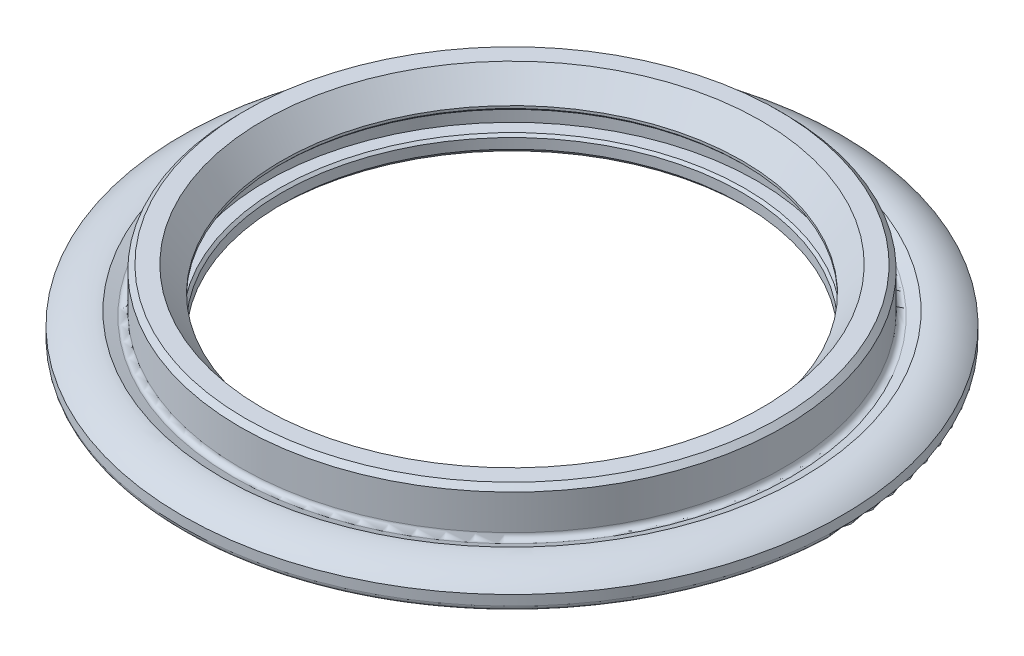
ISO-10303-21;
HEADER;
FILE_DESCRIPTION(('STEP AP214'),'2;1');
FILE_NAME('part.step','',(''),(''),'','','');
FILE_SCHEMA(('AUTOMOTIVE_DESIGN { 1 0 10303 214 1 1 1 1 }'));
ENDSEC;
DATA;
#1=APPLICATION_CONTEXT('core data for automotive mechanical design processes');
#2=APPLICATION_PROTOCOL_DEFINITION('international standard','automotive_design',2000,#1);
#3=PRODUCT_CONTEXT('',#1,'mechanical');
#4=PRODUCT('Part','Part','',(#3));
#5=PRODUCT_RELATED_PRODUCT_CATEGORY('part','',(#4));
#6=PRODUCT_DEFINITION_FORMATION('','',#4);
#7=PRODUCT_DEFINITION_CONTEXT('part definition',#1,'design');
#8=PRODUCT_DEFINITION('design','',#6,#7);
#9=PRODUCT_DEFINITION_SHAPE('','',#8);
#10=(LENGTH_UNIT() NAMED_UNIT(*) SI_UNIT(.MILLI.,.METRE.));
#11=(NAMED_UNIT(*) PLANE_ANGLE_UNIT() SI_UNIT($,.RADIAN.));
#12=(NAMED_UNIT(*) SI_UNIT($,.STERADIAN.) SOLID_ANGLE_UNIT());
#13=UNCERTAINTY_MEASURE_WITH_UNIT(LENGTH_MEASURE(1.E-05),#10,'distance_accuracy_value','');
#14=(GEOMETRIC_REPRESENTATION_CONTEXT(3) GLOBAL_UNCERTAINTY_ASSIGNED_CONTEXT((#13)) GLOBAL_UNIT_ASSIGNED_CONTEXT((#10,
#11,#12)) REPRESENTATION_CONTEXT('',''));
#15=CARTESIAN_POINT('',(0.,0.,0.));
#16=DIRECTION('',(0.,0.,1.));
#17=DIRECTION('',(1.,0.,0.));
#18=AXIS2_PLACEMENT_3D('',#15,#16,#17);
#19=CARTESIAN_POINT('',(63.6666666666667,0.,0.));
#20=DIRECTION('',(0.,-1.,0.));
#21=DIRECTION('',(0.,0.,-1.));
#22=AXIS2_PLACEMENT_3D('',#19,#20,#21);
#23=PLANE('',#22);
#24=CARTESIAN_POINT('',(0.,0.,0.));
#25=DIRECTION('',(0.,-1.,0.));
#26=DIRECTION('',(0.,0.,-1.));
#27=AXIS2_PLACEMENT_3D('',#24,#25,#26);
#28=CIRCLE('',#27,64.5);
#29=CARTESIAN_POINT('',(0.,0.,-64.5));
#30=VERTEX_POINT('',#29);
#31=EDGE_CURVE('E72',#30,#30,#28,.T.);
#32=ORIENTED_EDGE('',*,*,#31,.T.);
#33=EDGE_LOOP('',(#32));
#34=FACE_BOUND('',#33,.T.);
#35=CARTESIAN_POINT('',(0.,0.,0.));
#36=DIRECTION('',(0.,-1.,0.));
#37=DIRECTION('',(0.,0.,-1.));
#38=AXIS2_PLACEMENT_3D('',#35,#36,#37);
#39=CIRCLE('',#38,64.);
#40=CARTESIAN_POINT('',(0.,0.,-64.));
#41=VERTEX_POINT('',#40);
#42=EDGE_CURVE('E75',#41,#41,#39,.F.);
#43=ORIENTED_EDGE('',*,*,#42,.T.);
#44=EDGE_LOOP('',(#43));
#45=FACE_BOUND('',#44,.T.);
#46=ADVANCED_FACE('F31',(#34,#45),#23,.T.);
#47=CARTESIAN_POINT('',(0.,2.,0.));
#48=DIRECTION('',(0.,-1.,0.));
#49=DIRECTION('',(0.,0.,-1.));
#50=AXIS2_PLACEMENT_3D('',#47,#48,#49);
#51=CONICAL_SURFACE('',#50,61.,0.927295218001611);
#52=CARTESIAN_POINT('',(0.,0.200000000000006,0.));
#53=DIRECTION('',(0.,1.,0.));
#54=DIRECTION('',(0.,0.,1.));
#55=AXIS2_PLACEMENT_3D('',#52,#53,#54);
#56=CIRCLE('',#55,63.4);
#57=CARTESIAN_POINT('',(0.,0.200000000000006,63.4));
#58=VERTEX_POINT('',#57);
#59=EDGE_CURVE('E78',#58,#58,#56,.F.);
#60=ORIENTED_EDGE('',*,*,#59,.T.);
#61=EDGE_LOOP('',(#60));
#62=FACE_BOUND('',#61,.T.);
#63=CARTESIAN_POINT('',(0.,1.1509819027774,0.));
#64=DIRECTION('',(0.,-1.,0.));
#65=DIRECTION('',(0.,0.,-1.));
#66=AXIS2_PLACEMENT_3D('',#63,#64,#65);
#67=CIRCLE('',#66,62.1320241296301);
#68=CARTESIAN_POINT('',(0.,1.1509819027774,-62.1320241296301));
#69=VERTEX_POINT('',#68);
#70=EDGE_CURVE('E81',#69,#69,#67,.F.);
#71=ORIENTED_EDGE('',*,*,#70,.T.);
#72=EDGE_LOOP('',(#71));
#73=FACE_BOUND('',#72,.T.);
#74=ADVANCED_FACE('F126',(#62,#73),#51,.F.);
#75=CARTESIAN_POINT('',(0.,0.,0.));
#76=DIRECTION('',(0.,1.,0.));
#77=DIRECTION('',(0.,0.,1.));
#78=AXIS2_PLACEMENT_3D('',#75,#76,#77);
#79=CONICAL_SURFACE('',#78,58.,0.982793723247328);
#80=CARTESIAN_POINT('',(0.,1.21508249145309,0.));
#81=DIRECTION('',(0.,1.,0.));
#82=DIRECTION('',(0.,0.,1.));
#83=AXIS2_PLACEMENT_3D('',#80,#81,#82);
#84=CIRCLE('',#83,59.8226237371796);
#85=CARTESIAN_POINT('',(0.,1.21508249145309,59.8226237371796));
#86=VERTEX_POINT('',#85);
#87=EDGE_CURVE('E84',#86,#86,#84,.F.);
#88=ORIENTED_EDGE('',*,*,#87,.T.);
#89=EDGE_LOOP('',(#88));
#90=FACE_BOUND('',#89,.T.);
#91=CARTESIAN_POINT('',(0.,0.,0.));
#92=DIRECTION('',(0.,-1.,0.));
#93=DIRECTION('',(0.,0.,-1.));
#94=AXIS2_PLACEMENT_3D('',#91,#92,#93);
#95=CIRCLE('',#94,58.);
#96=CARTESIAN_POINT('',(0.,0.,-58.));
#97=VERTEX_POINT('',#96);
#98=EDGE_CURVE('E87',#97,#97,#95,.T.);
#99=ORIENTED_EDGE('',*,*,#98,.F.);
#100=EDGE_LOOP('',(#99));
#101=FACE_BOUND('',#100,.T.);
#102=ADVANCED_FACE('F132',(#90,#101),#79,.T.);
#103=CARTESIAN_POINT('',(45.75,0.,0.));
#104=DIRECTION('',(0.,-1.,0.));
#105=DIRECTION('',(0.,0.,-1.));
#106=AXIS2_PLACEMENT_3D('',#103,#104,#105);
#107=PLANE('',#106);
#108=CARTESIAN_POINT('',(0.,0.,0.));
#109=DIRECTION('',(0.,-1.,0.));
#110=DIRECTION('',(0.,0.,-1.));
#111=AXIS2_PLACEMENT_3D('',#108,#109,#110);
#112=CIRCLE('',#111,46.75);
#113=CARTESIAN_POINT('',(0.,0.,-46.75));
#114=VERTEX_POINT('',#113);
#115=EDGE_CURVE('E63',#114,#114,#112,.F.);
#116=ORIENTED_EDGE('',*,*,#115,.T.);
#117=EDGE_LOOP('',(#116));
#118=FACE_BOUND('',#117,.T.);
#119=ORIENTED_EDGE('',*,*,#98,.T.);
#120=EDGE_LOOP('',(#119));
#121=FACE_BOUND('',#120,.T.);
#122=ADVANCED_FACE('F203',(#118,#121),#107,.T.);
#123=CARTESIAN_POINT('',(0.,-63.3291029718349,0.));
#124=DIRECTION('',(0.,-1.,0.));
#125=DIRECTION('',(0.,0.,-1.));
#126=AXIS2_PLACEMENT_3D('',#123,#124,#125);
#127=CYLINDRICAL_SURFACE('',#126,45.75);
#128=CARTESIAN_POINT('',(0.,2.99999999999998,0.));
#129=DIRECTION('',(0.,1.,0.));
#130=DIRECTION('',(0.,0.,1.));
#131=AXIS2_PLACEMENT_3D('',#128,#129,#130);
#132=CIRCLE('',#131,45.75);
#133=CARTESIAN_POINT('',(0.,2.99999999999998,45.75));
#134=VERTEX_POINT('',#133);
#135=EDGE_CURVE('E57',#134,#134,#132,.T.);
#136=ORIENTED_EDGE('',*,*,#135,.T.);
#137=EDGE_LOOP('',(#136));
#138=FACE_BOUND('',#137,.T.);
#139=CARTESIAN_POINT('',(0.,1.,0.));
#140=DIRECTION('',(0.,-1.,0.));
#141=DIRECTION('',(0.,0.,-1.));
#142=AXIS2_PLACEMENT_3D('',#139,#140,#141);
#143=CIRCLE('',#142,45.75);
#144=CARTESIAN_POINT('',(0.,1.,-45.75));
#145=VERTEX_POINT('',#144);
#146=EDGE_CURVE('E66',#145,#145,#143,.T.);
#147=ORIENTED_EDGE('',*,*,#146,.T.);
#148=EDGE_LOOP('',(#147));
#149=FACE_BOUND('',#148,.T.);
#150=ADVANCED_FACE('F199',(#138,#149),#127,.F.);
#151=CARTESIAN_POINT('',(48.75,3.5,0.));
#152=DIRECTION('',(0.,1.,0.));
#153=DIRECTION('',(0.,0.,1.));
#154=AXIS2_PLACEMENT_3D('',#151,#152,#153);
#155=PLANE('',#154);
#156=CARTESIAN_POINT('',(0.,3.5,0.));
#157=DIRECTION('',(0.,1.,0.));
#158=DIRECTION('',(0.,0.,1.));
#159=AXIS2_PLACEMENT_3D('',#156,#157,#158);
#160=CIRCLE('',#159,46.25);
#161=CARTESIAN_POINT('',(0.,3.5,46.25));
#162=VERTEX_POINT('',#161);
#163=EDGE_CURVE('E60',#162,#162,#160,.F.);
#164=ORIENTED_EDGE('',*,*,#163,.T.);
#165=EDGE_LOOP('',(#164));
#166=FACE_BOUND('',#165,.T.);
#167=CARTESIAN_POINT('',(0.,3.5,0.));
#168=DIRECTION('',(0.,-1.,0.));
#169=DIRECTION('',(0.,0.,-1.));
#170=AXIS2_PLACEMENT_3D('',#167,#168,#169);
#171=CIRCLE('',#170,48.75);
#172=CARTESIAN_POINT('',(0.,3.5,-48.75));
#173=VERTEX_POINT('',#172);
#174=EDGE_CURVE('E90',#173,#173,#171,.T.);
#175=ORIENTED_EDGE('',*,*,#174,.F.);
#176=EDGE_LOOP('',(#175));
#177=FACE_BOUND('',#176,.T.);
#178=ADVANCED_FACE('F195',(#166,#177),#155,.T.);
#179=CARTESIAN_POINT('',(0.,-63.3291029718349,0.));
#180=DIRECTION('',(0.,-1.,0.));
#181=DIRECTION('',(0.,0.,-1.));
#182=AXIS2_PLACEMENT_3D('',#179,#180,#181);
#183=CYLINDRICAL_SURFACE('',#182,48.75);
#184=ORIENTED_EDGE('',*,*,#174,.T.);
#185=EDGE_LOOP('',(#184));
#186=FACE_BOUND('',#185,.T.);
#187=CARTESIAN_POINT('',(0.,7.50000000000001,0.));
#188=DIRECTION('',(0.,-1.,0.));
#189=DIRECTION('',(0.,0.,-1.));
#190=AXIS2_PLACEMENT_3D('',#187,#188,#189);
#191=CIRCLE('',#190,48.75);
#192=CARTESIAN_POINT('',(0.,7.50000000000001,-48.75));
#193=VERTEX_POINT('',#192);
#194=EDGE_CURVE('E93',#193,#193,#191,.T.);
#195=ORIENTED_EDGE('',*,*,#194,.F.);
#196=EDGE_LOOP('',(#195));
#197=FACE_BOUND('',#196,.T.);
#198=ADVANCED_FACE('F191',(#186,#197),#183,.F.);
#199=CARTESIAN_POINT('',(45.75,7.5,0.));
#200=DIRECTION('',(0.,-1.,0.));
#201=DIRECTION('',(0.,0.,-1.));
#202=AXIS2_PLACEMENT_3D('',#199,#200,#201);
#203=PLANE('',#202);
#204=CARTESIAN_POINT('',(0.,7.5,0.));
#205=DIRECTION('',(0.,-1.,0.));
#206=DIRECTION('',(0.,0.,-1.));
#207=AXIS2_PLACEMENT_3D('',#204,#205,#206);
#208=CIRCLE('',#207,46.25);
#209=CARTESIAN_POINT('',(0.,7.5,-46.25));
#210=VERTEX_POINT('',#209);
#211=EDGE_CURVE('E51',#210,#210,#208,.F.);
#212=ORIENTED_EDGE('',*,*,#211,.T.);
#213=EDGE_LOOP('',(#212));
#214=FACE_BOUND('',#213,.T.);
#215=ORIENTED_EDGE('',*,*,#194,.T.);
#216=EDGE_LOOP('',(#215));
#217=FACE_BOUND('',#216,.T.);
#218=ADVANCED_FACE('F187',(#214,#217),#203,.T.);
#219=CARTESIAN_POINT('',(0.,-63.3291029718349,0.));
#220=DIRECTION('',(0.,-1.,0.));
#221=DIRECTION('',(0.,0.,-1.));
#222=AXIS2_PLACEMENT_3D('',#219,#220,#221);
#223=CYLINDRICAL_SURFACE('',#222,45.75);
#224=CARTESIAN_POINT('',(0.,8.00000000000001,0.));
#225=DIRECTION('',(0.,-1.,0.));
#226=DIRECTION('',(0.,0.,-1.));
#227=AXIS2_PLACEMENT_3D('',#224,#225,#226);
#228=CIRCLE('',#227,45.75);
#229=CARTESIAN_POINT('',(0.,8.00000000000001,-45.75));
#230=VERTEX_POINT('',#229);
#231=EDGE_CURVE('E54',#230,#230,#228,.T.);
#232=ORIENTED_EDGE('',*,*,#231,.T.);
#233=EDGE_LOOP('',(#232));
#234=FACE_BOUND('',#233,.T.);
#235=CARTESIAN_POINT('',(0.,8.49999999999999,0.));
#236=DIRECTION('',(0.,-1.,0.));
#237=DIRECTION('',(0.,0.,-1.));
#238=AXIS2_PLACEMENT_3D('',#235,#236,#237);
#239=CIRCLE('',#238,45.75);
#240=CARTESIAN_POINT('',(0.,8.49999999999999,-45.75));
#241=VERTEX_POINT('',#240);
#242=EDGE_CURVE('E96',#241,#241,#239,.T.);
#243=ORIENTED_EDGE('',*,*,#242,.F.);
#244=EDGE_LOOP('',(#243));
#245=FACE_BOUND('',#244,.T.);
#246=ADVANCED_FACE('F183',(#234,#245),#223,.F.);
#247=CARTESIAN_POINT('',(0.,13.5,0.));
#248=DIRECTION('',(0.,1.,0.));
#249=DIRECTION('',(0.,0.,1.));
#250=AXIS2_PLACEMENT_3D('',#247,#248,#249);
#251=CONICAL_SURFACE('',#250,49.5,0.643501108793284);
#252=ORIENTED_EDGE('',*,*,#242,.T.);
#253=EDGE_LOOP('',(#252));
#254=FACE_BOUND('',#253,.T.);
#255=CARTESIAN_POINT('',(0.,13.5,0.));
#256=DIRECTION('',(0.,-1.,0.));
#257=DIRECTION('',(0.,0.,-1.));
#258=AXIS2_PLACEMENT_3D('',#255,#256,#257);
#259=CIRCLE('',#258,49.5);
#260=CARTESIAN_POINT('',(0.,13.5,-49.5));
#261=VERTEX_POINT('',#260);
#262=EDGE_CURVE('E99',#261,#261,#259,.T.);
#263=ORIENTED_EDGE('',*,*,#262,.F.);
#264=EDGE_LOOP('',(#263));
#265=FACE_BOUND('',#264,.T.);
#266=ADVANCED_FACE('F177',(#254,#265),#251,.F.);
#267=CARTESIAN_POINT('',(54.,13.5,0.));
#268=DIRECTION('',(0.,1.,0.));
#269=DIRECTION('',(0.,0.,1.));
#270=AXIS2_PLACEMENT_3D('',#267,#268,#269);
#271=PLANE('',#270);
#272=CARTESIAN_POINT('',(0.,13.5,0.));
#273=DIRECTION('',(0.,1.,0.));
#274=DIRECTION('',(0.,0.,1.));
#275=AXIS2_PLACEMENT_3D('',#272,#273,#274);
#276=CIRCLE('',#275,52.9999999999999);
#277=CARTESIAN_POINT('',(0.,13.5,52.9999999999999));
#278=VERTEX_POINT('',#277);
#279=EDGE_CURVE('E42',#278,#278,#276,.T.);
#280=ORIENTED_EDGE('',*,*,#279,.T.);
#281=EDGE_LOOP('',(#280));
#282=FACE_BOUND('',#281,.T.);
#283=ORIENTED_EDGE('',*,*,#262,.T.);
#284=EDGE_LOOP('',(#283));
#285=FACE_BOUND('',#284,.T.);
#286=ADVANCED_FACE('F172',(#282,#285),#271,.T.);
#287=CARTESIAN_POINT('',(0.,-63.3291029718349,0.));
#288=DIRECTION('',(0.,-1.,0.));
#289=DIRECTION('',(0.,0.,-1.));
#290=AXIS2_PLACEMENT_3D('',#287,#288,#289);
#291=CYLINDRICAL_SURFACE('',#290,54.);
#292=CARTESIAN_POINT('',(0.,5.51653901512342,0.));
#293=DIRECTION('',(0.,-1.,0.));
#294=DIRECTION('',(0.,0.,-1.));
#295=AXIS2_PLACEMENT_3D('',#292,#293,#294);
#296=CIRCLE('',#295,54.);
#297=CARTESIAN_POINT('',(0.,5.51653901512342,-54.));
#298=VERTEX_POINT('',#297);
#299=EDGE_CURVE('E10',#298,#298,#296,.F.);
#300=ORIENTED_EDGE('',*,*,#299,.T.);
#301=EDGE_LOOP('',(#300));
#302=FACE_BOUND('',#301,.T.);
#303=CARTESIAN_POINT('',(0.,12.5,0.));
#304=DIRECTION('',(0.,1.,0.));
#305=DIRECTION('',(0.,0.,1.));
#306=AXIS2_PLACEMENT_3D('',#303,#304,#305);
#307=CIRCLE('',#306,54.);
#308=CARTESIAN_POINT('',(0.,12.5,54.));
#309=VERTEX_POINT('',#308);
#310=EDGE_CURVE('E46',#309,#309,#307,.F.);
#311=ORIENTED_EDGE('',*,*,#310,.T.);
#312=EDGE_LOOP('',(#311));
#313=FACE_BOUND('',#312,.T.);
#314=ADVANCED_FACE('F123',(#302,#313),#291,.T.);
#315=CARTESIAN_POINT('',(0.,5.50000000000001,0.));
#316=DIRECTION('',(0.,1.,0.));
#317=DIRECTION('',(0.,0.,1.));
#318=AXIS2_PLACEMENT_3D('',#315,#316,#317);
#319=CONICAL_SURFACE('',#318,57.5,1.16590454050981);
#320=CARTESIAN_POINT('',(0.,4.59739398510536,0.));
#321=DIRECTION('',(0.,1.,0.));
#322=DIRECTION('',(0.,0.,1.));
#323=AXIS2_PLACEMENT_3D('',#320,#321,#322);
#324=CIRCLE('',#323,55.3939192985792);
#325=CARTESIAN_POINT('',(0.,4.59739398510536,55.3939192985792));
#326=VERTEX_POINT('',#325);
#327=EDGE_CURVE('E38',#326,#326,#324,.F.);
#328=ORIENTED_EDGE('',*,*,#327,.T.);
#329=EDGE_LOOP('',(#328));
#330=FACE_BOUND('',#329,.T.);
#331=CARTESIAN_POINT('',(0.,5.50000000000001,0.));
#332=DIRECTION('',(0.,-1.,0.));
#333=DIRECTION('',(0.,0.,-1.));
#334=AXIS2_PLACEMENT_3D('',#331,#332,#333);
#335=CIRCLE('',#334,57.5);
#336=CARTESIAN_POINT('',(0.,5.50000000000001,-57.5));
#337=VERTEX_POINT('',#336);
#338=EDGE_CURVE('E102',#337,#337,#335,.T.);
#339=ORIENTED_EDGE('',*,*,#338,.F.);
#340=EDGE_LOOP('',(#339));
#341=FACE_BOUND('',#340,.T.);
#342=ADVANCED_FACE('F113',(#330,#341),#319,.F.);
#343=CARTESIAN_POINT('',(0.,-4.41621040864893,0.));
#344=DIRECTION('',(0.,-1.,0.));
#345=DIRECTION('',(0.,0.,-1.));
#346=AXIS2_PLACEMENT_3D('',#343,#344,#345);
#347=TOROIDAL_SURFACE('',#346,58.7918092472972,10.);
#348=ORIENTED_EDGE('',*,*,#338,.T.);
#349=EDGE_LOOP('',(#348));
#350=FACE_BOUND('',#349,.T.);
#351=CARTESIAN_POINT('',(0.,3.,0.));
#352=DIRECTION('',(0.,-1.,0.));
#353=DIRECTION('',(0.,0.,-1.));
#354=AXIS2_PLACEMENT_3D('',#351,#352,#353);
#355=CIRCLE('',#354,65.5);
#356=CARTESIAN_POINT('',(0.,3.,-65.5));
#357=VERTEX_POINT('',#356);
#358=EDGE_CURVE('E105',#357,#357,#355,.T.);
#359=ORIENTED_EDGE('',*,*,#358,.F.);
#360=EDGE_LOOP('',(#359));
#361=FACE_BOUND('',#360,.T.);
#362=ADVANCED_FACE('F111',(#350,#361),#347,.T.);
#363=CARTESIAN_POINT('',(0.,-63.3291029718349,0.));
#364=DIRECTION('',(0.,-1.,0.));
#365=DIRECTION('',(0.,0.,-1.));
#366=AXIS2_PLACEMENT_3D('',#363,#364,#365);
#367=CYLINDRICAL_SURFACE('',#366,65.5);
#368=CARTESIAN_POINT('',(0.,1.,0.));
#369=DIRECTION('',(0.,-1.,0.));
#370=DIRECTION('',(0.,0.,-1.));
#371=AXIS2_PLACEMENT_3D('',#368,#369,#370);
#372=CIRCLE('',#371,65.5);
#373=CARTESIAN_POINT('',(0.,1.,-65.5));
#374=VERTEX_POINT('',#373);
#375=EDGE_CURVE('E69',#374,#374,#372,.F.);
#376=ORIENTED_EDGE('',*,*,#375,.T.);
#377=EDGE_LOOP('',(#376));
#378=FACE_BOUND('',#377,.T.);
#379=ORIENTED_EDGE('',*,*,#358,.T.);
#380=EDGE_LOOP('',(#379));
#381=FACE_BOUND('',#380,.T.);
#382=ADVANCED_FACE('F109',(#378,#381),#367,.T.);
#383=CARTESIAN_POINT('',(0.,-0.449018097222583,0.));
#384=DIRECTION('',(0.,-1.,0.));
#385=DIRECTION('',(0.,0.,-1.));
#386=AXIS2_PLACEMENT_3D('',#383,#384,#385);
#387=TOROIDAL_SURFACE('',#386,60.9320241296301,2.);
#388=ORIENTED_EDGE('',*,*,#70,.F.);
#389=EDGE_LOOP('',(#388));
#390=FACE_BOUND('',#389,.T.);
#391=ORIENTED_EDGE('',*,*,#87,.F.);
#392=EDGE_LOOP('',(#391));
#393=FACE_BOUND('',#392,.T.);
#394=ADVANCED_FACE('F120',(#390,#393),#387,.F.);
#395=CARTESIAN_POINT('',(0.,1.,0.));
#396=DIRECTION('',(0.,-1.,0.));
#397=DIRECTION('',(0.,0.,-1.));
#398=AXIS2_PLACEMENT_3D('',#395,#396,#397);
#399=TOROIDAL_SURFACE('',#398,64.,1.);
#400=ORIENTED_EDGE('',*,*,#42,.F.);
#401=EDGE_LOOP('',(#400));
#402=FACE_BOUND('',#401,.T.);
#403=ORIENTED_EDGE('',*,*,#59,.F.);
#404=EDGE_LOOP('',(#403));
#405=FACE_BOUND('',#404,.T.);
#406=ADVANCED_FACE('F140',(#402,#405),#399,.T.);
#407=CARTESIAN_POINT('',(0.,1.,0.));
#408=DIRECTION('',(0.,-1.,0.));
#409=DIRECTION('',(0.,0.,-1.));
#410=AXIS2_PLACEMENT_3D('',#407,#408,#409);
#411=TOROIDAL_SURFACE('',#410,64.5,1.);
#412=ORIENTED_EDGE('',*,*,#375,.F.);
#413=EDGE_LOOP('',(#412));
#414=FACE_BOUND('',#413,.T.);
#415=ORIENTED_EDGE('',*,*,#31,.F.);
#416=EDGE_LOOP('',(#415));
#417=FACE_BOUND('',#416,.T.);
#418=ADVANCED_FACE('F144',(#414,#417),#411,.T.);
#419=CARTESIAN_POINT('',(0.,1.,0.));
#420=DIRECTION('',(0.,-1.,0.));
#421=DIRECTION('',(0.,0.,-1.));
#422=AXIS2_PLACEMENT_3D('',#419,#420,#421);
#423=CONICAL_SURFACE('',#422,45.75,0.785398163397452);
#424=ORIENTED_EDGE('',*,*,#115,.F.);
#425=EDGE_LOOP('',(#424));
#426=FACE_BOUND('',#425,.T.);
#427=ORIENTED_EDGE('',*,*,#146,.F.);
#428=EDGE_LOOP('',(#427));
#429=FACE_BOUND('',#428,.T.);
#430=ADVANCED_FACE('F148',(#426,#429),#423,.F.);
#431=CARTESIAN_POINT('',(0.,3.5,0.));
#432=DIRECTION('',(0.,1.,0.));
#433=DIRECTION('',(0.,0.,1.));
#434=AXIS2_PLACEMENT_3D('',#431,#432,#433);
#435=CONICAL_SURFACE('',#434,46.2500000000001,0.785398163397462);
#436=ORIENTED_EDGE('',*,*,#135,.F.);
#437=EDGE_LOOP('',(#436));
#438=FACE_BOUND('',#437,.T.);
#439=ORIENTED_EDGE('',*,*,#163,.F.);
#440=EDGE_LOOP('',(#439));
#441=FACE_BOUND('',#440,.T.);
#442=ADVANCED_FACE('F152',(#438,#441),#435,.F.);
#443=CARTESIAN_POINT('',(0.,8.00000000000001,0.));
#444=DIRECTION('',(0.,-1.,0.));
#445=DIRECTION('',(0.,0.,-1.));
#446=AXIS2_PLACEMENT_3D('',#443,#444,#445);
#447=CONICAL_SURFACE('',#446,45.75,0.785398163397462);
#448=ORIENTED_EDGE('',*,*,#211,.F.);
#449=EDGE_LOOP('',(#448));
#450=FACE_BOUND('',#449,.T.);
#451=ORIENTED_EDGE('',*,*,#231,.F.);
#452=EDGE_LOOP('',(#451));
#453=FACE_BOUND('',#452,.T.);
#454=ADVANCED_FACE('F156',(#450,#453),#447,.F.);
#455=CARTESIAN_POINT('',(0.,12.5,0.));
#456=DIRECTION('',(0.,-1.,0.));
#457=DIRECTION('',(0.,0.,-1.));
#458=AXIS2_PLACEMENT_3D('',#455,#456,#457);
#459=CONICAL_SURFACE('',#458,54.,0.785398163397462);
#460=ORIENTED_EDGE('',*,*,#279,.F.);
#461=EDGE_LOOP('',(#460));
#462=FACE_BOUND('',#461,.T.);
#463=ORIENTED_EDGE('',*,*,#310,.F.);
#464=EDGE_LOOP('',(#463));
#465=FACE_BOUND('',#464,.T.);
#466=ADVANCED_FACE('F159',(#462,#465),#459,.T.);
#467=CARTESIAN_POINT('',(0.,5.51653901512342,0.));
#468=DIRECTION('',(0.,-1.,0.));
#469=DIRECTION('',(0.,0.,-1.));
#470=AXIS2_PLACEMENT_3D('',#467,#468,#469);
#471=TOROIDAL_SURFACE('',#470,55.,1.);
#472=ORIENTED_EDGE('',*,*,#299,.F.);
#473=EDGE_LOOP('',(#472));
#474=FACE_BOUND('',#473,.T.);
#475=ORIENTED_EDGE('',*,*,#327,.F.);
#476=EDGE_LOOP('',(#475));
#477=FACE_BOUND('',#476,.T.);
#478=ADVANCED_FACE('F33',(#474,#477),#471,.F.);
#479=CLOSED_SHELL('',(#46,#74,#102,#122,#150,#178,#198,#218,#246,#266,#286,#314,#342,#362,#382,
#394,#406,#418,#430,#442,#454,#466,#478));
#480=MANIFOLD_SOLID_BREP('B2',#479);
#481=ADVANCED_BREP_SHAPE_REPRESENTATION('',(#18,#480),#14);
#482=SHAPE_DEFINITION_REPRESENTATION(#9,#481);
ENDSEC;
END-ISO-10303-21;
